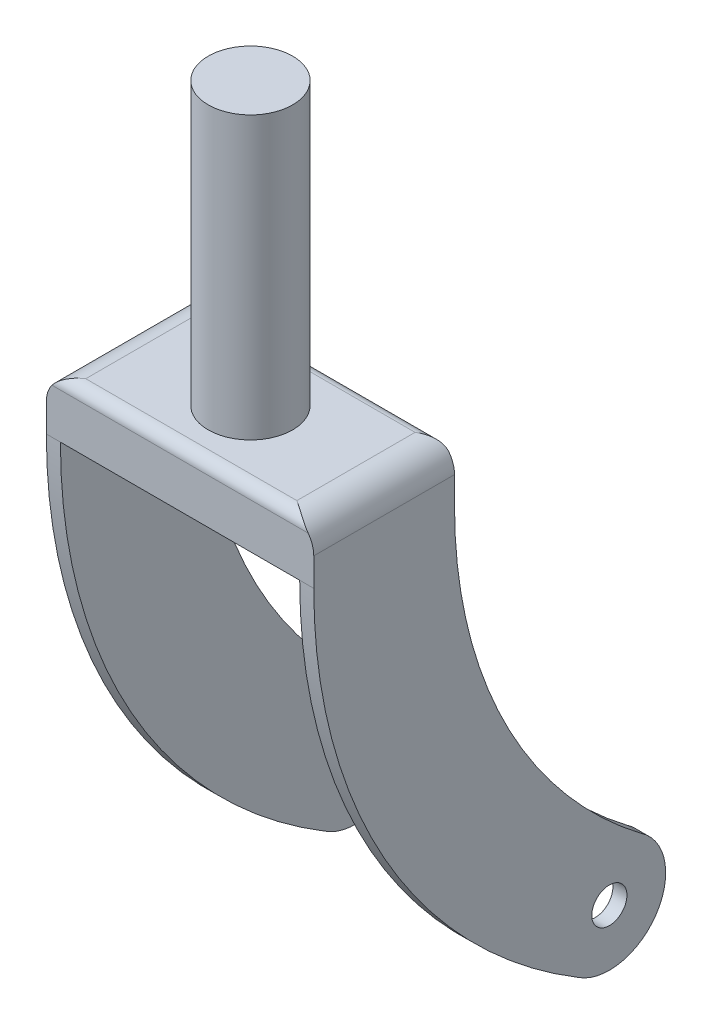
ISO-10303-21;
HEADER;
FILE_DESCRIPTION(('STEP AP214'),'2;1');
FILE_NAME('part.step','',(''),(''),'','','');
FILE_SCHEMA(('AUTOMOTIVE_DESIGN { 1 0 10303 214 1 1 1 1 }'));
ENDSEC;
DATA;
#1=APPLICATION_CONTEXT('core data for automotive mechanical design processes');
#2=APPLICATION_PROTOCOL_DEFINITION('international standard','automotive_design',2000,#1);
#3=PRODUCT_CONTEXT('',#1,'mechanical');
#4=PRODUCT('Part','Part','',(#3));
#5=PRODUCT_RELATED_PRODUCT_CATEGORY('part','',(#4));
#6=PRODUCT_DEFINITION_FORMATION('','',#4);
#7=PRODUCT_DEFINITION_CONTEXT('part definition',#1,'design');
#8=PRODUCT_DEFINITION('design','',#6,#7);
#9=PRODUCT_DEFINITION_SHAPE('','',#8);
#10=(LENGTH_UNIT() NAMED_UNIT(*) SI_UNIT(.MILLI.,.METRE.));
#11=(NAMED_UNIT(*) PLANE_ANGLE_UNIT() SI_UNIT($,.RADIAN.));
#12=(NAMED_UNIT(*) SI_UNIT($,.STERADIAN.) SOLID_ANGLE_UNIT());
#13=UNCERTAINTY_MEASURE_WITH_UNIT(LENGTH_MEASURE(1.E-05),#10,'distance_accuracy_value','');
#14=(GEOMETRIC_REPRESENTATION_CONTEXT(3) GLOBAL_UNCERTAINTY_ASSIGNED_CONTEXT((#13)) GLOBAL_UNIT_ASSIGNED_CONTEXT((#10,
#11,#12)) REPRESENTATION_CONTEXT('',''));
#15=CARTESIAN_POINT('',(0.,0.,0.));
#16=DIRECTION('',(0.,0.,1.));
#17=DIRECTION('',(1.,0.,0.));
#18=AXIS2_PLACEMENT_3D('',#15,#16,#17);
#19=CARTESIAN_POINT('',(-30.1625,107.95,66.675));
#20=DIRECTION('',(0.,1.,0.));
#21=DIRECTION('',(0.,0.,1.));
#22=AXIS2_PLACEMENT_3D('',#19,#20,#21);
#23=PLANE('',#22);
#24=DIRECTION('',(1.,0.,0.));
#25=VECTOR('',#24,1.);
#26=CARTESIAN_POINT('',(-30.1625,107.95,64.135));
#27=LINE('',#26,#25);
#28=CARTESIAN_POINT('',(-23.8125,107.95,64.135));
#29=VERTEX_POINT('',#28);
#30=CARTESIAN_POINT('',(23.8125,107.95,64.135));
#31=VERTEX_POINT('',#30);
#32=EDGE_CURVE('E195',#29,#31,#27,.T.);
#33=ORIENTED_EDGE('',*,*,#32,.T.);
#34=DIRECTION('',(0.,0.,1.));
#35=VECTOR('',#34,1.);
#36=CARTESIAN_POINT('',(23.8125,107.95,66.675));
#37=LINE('',#36,#35);
#38=CARTESIAN_POINT('',(23.8125,107.95,37.465));
#39=VERTEX_POINT('',#38);
#40=EDGE_CURVE('E198',#31,#39,#37,.F.);
#41=ORIENTED_EDGE('',*,*,#40,.T.);
#42=DIRECTION('',(1.,0.,0.));
#43=VECTOR('',#42,1.);
#44=CARTESIAN_POINT('',(-30.1625,107.95,37.465));
#45=LINE('',#44,#43);
#46=CARTESIAN_POINT('',(-23.8125,107.95,37.465));
#47=VERTEX_POINT('',#46);
#48=EDGE_CURVE('E192',#39,#47,#45,.F.);
#49=ORIENTED_EDGE('',*,*,#48,.T.);
#50=DIRECTION('',(0.,0.,1.));
#51=VECTOR('',#50,1.);
#52=CARTESIAN_POINT('',(-23.8125,107.95,66.675));
#53=LINE('',#52,#51);
#54=EDGE_CURVE('E190',#47,#29,#53,.T.);
#55=ORIENTED_EDGE('',*,*,#54,.T.);
#56=EDGE_LOOP('',(#33,#41,#49,#55));
#57=FACE_BOUND('',#56,.T.);
#58=CARTESIAN_POINT('',(0.,107.95,50.8));
#59=DIRECTION('',(0.,1.,0.));
#60=DIRECTION('',(0.,0.,1.));
#61=AXIS2_PLACEMENT_3D('',#58,#59,#60);
#62=CIRCLE('',#61,9.525);
#63=CARTESIAN_POINT('',(0.,107.95,60.325));
#64=VERTEX_POINT('',#63);
#65=EDGE_CURVE('E241',#64,#64,#62,.T.);
#66=ORIENTED_EDGE('',*,*,#65,.F.);
#67=EDGE_LOOP('',(#66));
#68=FACE_BOUND('',#67,.T.);
#69=ADVANCED_FACE('F34',(#57,#68),#23,.T.);
#70=CARTESIAN_POINT('',(-30.1625,95.25,-71.4873299764583));
#71=DIRECTION('',(1.,0.,0.));
#72=DIRECTION('',(0.,0.,-1.));
#73=AXIS2_PLACEMENT_3D('',#70,#71,#72);
#74=CYLINDRICAL_SURFACE('',#73,106.412329976458);
#75=CARTESIAN_POINT('',(-26.9875,95.25,-71.4873299764583));
#76=DIRECTION('',(-1.,0.,0.));
#77=DIRECTION('',(0.,-1.,0.));
#78=AXIS2_PLACEMENT_3D('',#75,#76,#77);
#79=CIRCLE('',#78,106.412329976458);
#80=CARTESIAN_POINT('',(-26.9875,10.5467128027682,-7.07508650519034));
#81=VERTEX_POINT('',#80);
#82=CARTESIAN_POINT('',(-26.9875,95.25,34.925));
#83=VERTEX_POINT('',#82);
#84=EDGE_CURVE('E147',#81,#83,#79,.T.);
#85=ORIENTED_EDGE('',*,*,#84,.F.);
#86=DIRECTION('',(1.,0.,0.));
#87=VECTOR('',#86,1.);
#88=CARTESIAN_POINT('',(-30.1625,10.5467128027682,-7.07508650519034));
#89=LINE('',#88,#87);
#90=CARTESIAN_POINT('',(-30.1625,10.5467128027682,-7.07508650519034));
#91=VERTEX_POINT('',#90);
#92=EDGE_CURVE('E291',#91,#81,#89,.T.);
#93=ORIENTED_EDGE('',*,*,#92,.F.);
#94=CARTESIAN_POINT('',(-30.1625,95.25,-71.4873299764583));
#95=DIRECTION('',(-1.,0.,0.));
#96=DIRECTION('',(0.,0.,-1.));
#97=AXIS2_PLACEMENT_3D('',#94,#95,#96);
#98=CIRCLE('',#97,106.412329976458);
#99=CARTESIAN_POINT('',(-30.1625,95.25,34.925));
#100=VERTEX_POINT('',#99);
#101=EDGE_CURVE('E285',#91,#100,#98,.T.);
#102=ORIENTED_EDGE('',*,*,#101,.T.);
#103=DIRECTION('',(1.,0.,0.));
#104=VECTOR('',#103,1.);
#105=CARTESIAN_POINT('',(-30.1625,95.25,34.925));
#106=LINE('',#105,#104);
#107=EDGE_CURVE('E193',#100,#83,#106,.T.);
#108=ORIENTED_EDGE('',*,*,#107,.T.);
#109=EDGE_LOOP('',(#85,#93,#102,#108));
#110=FACE_BOUND('',#109,.T.);
#111=ADVANCED_FACE('F313',(#110),#74,.F.);
#112=CARTESIAN_POINT('',(-30.1625,0.,0.));
#113=DIRECTION('',(1.,0.,0.));
#114=DIRECTION('',(0.,0.,-1.));
#115=AXIS2_PLACEMENT_3D('',#112,#113,#114);
#116=CYLINDRICAL_SURFACE('',#115,12.7);
#117=DIRECTION('',(1.,0.,0.));
#118=VECTOR('',#117,1.);
#119=CARTESIAN_POINT('',(-30.1625,-10.5467128027682,7.07508650519028));
#120=LINE('',#119,#118);
#121=CARTESIAN_POINT('',(26.9875,-10.5467128027682,7.07508650519028));
#122=VERTEX_POINT('',#121);
#123=CARTESIAN_POINT('',(30.1625,-10.5467128027682,7.07508650519028));
#124=VERTEX_POINT('',#123);
#125=EDGE_CURVE('E177',#122,#124,#120,.T.);
#126=ORIENTED_EDGE('',*,*,#125,.F.);
#127=CARTESIAN_POINT('',(26.9875,0.,0.));
#128=DIRECTION('',(1.,0.,0.));
#129=DIRECTION('',(0.,1.,0.));
#130=AXIS2_PLACEMENT_3D('',#127,#128,#129);
#131=CIRCLE('',#130,12.7);
#132=CARTESIAN_POINT('',(26.9875,10.5467128027682,-7.07508650519034));
#133=VERTEX_POINT('',#132);
#134=EDGE_CURVE('E301',#133,#122,#131,.F.);
#135=ORIENTED_EDGE('',*,*,#134,.F.);
#136=CARTESIAN_POINT('',(30.1625,10.5467128027682,-7.07508650519034));
#137=VERTEX_POINT('',#136);
#138=EDGE_CURVE('E293',#133,#137,#89,.T.);
#139=ORIENTED_EDGE('',*,*,#138,.T.);
#140=CARTESIAN_POINT('',(30.1625,0.,0.));
#141=DIRECTION('',(1.,0.,0.));
#142=DIRECTION('',(0.,0.,1.));
#143=AXIS2_PLACEMENT_3D('',#140,#141,#142);
#144=CIRCLE('',#143,12.7);
#145=EDGE_CURVE('E275',#124,#137,#144,.T.);
#146=ORIENTED_EDGE('',*,*,#145,.F.);
#147=EDGE_LOOP('',(#126,#135,#139,#146));
#148=FACE_BOUND('',#147,.T.);
#149=ADVANCED_FACE('F300',(#148),#116,.T.);
#150=CARTESIAN_POINT('',(-30.1625,95.25,-57.025633640553));
#151=DIRECTION('',(1.,0.,0.));
#152=DIRECTION('',(0.,0.,-1.));
#153=AXIS2_PLACEMENT_3D('',#150,#151,#152);
#154=CYLINDRICAL_SURFACE('',#153,123.700633640553);
#155=CARTESIAN_POINT('',(-26.9875,95.25,-57.025633640553));
#156=DIRECTION('',(-1.,0.,0.));
#157=DIRECTION('',(0.,-1.,0.));
#158=AXIS2_PLACEMENT_3D('',#155,#156,#157);
#159=CIRCLE('',#158,123.700633640553);
#160=CARTESIAN_POINT('',(-26.9875,95.25,66.6750000000001));
#161=VERTEX_POINT('',#160);
#162=CARTESIAN_POINT('',(-26.9875,-10.5467128027682,7.07508650519028));
#163=VERTEX_POINT('',#162);
#164=EDGE_CURVE('E144',#161,#163,#159,.F.);
#165=ORIENTED_EDGE('',*,*,#164,.F.);
#166=DIRECTION('',(1.,0.,0.));
#167=VECTOR('',#166,1.);
#168=CARTESIAN_POINT('',(-30.1625,95.25,66.675));
#169=LINE('',#168,#167);
#170=CARTESIAN_POINT('',(-30.1625,95.25,66.675));
#171=VERTEX_POINT('',#170);
#172=EDGE_CURVE('E167',#171,#161,#169,.T.);
#173=ORIENTED_EDGE('',*,*,#172,.F.);
#174=CARTESIAN_POINT('',(-30.1625,95.25,-57.025633640553));
#175=DIRECTION('',(1.,0.,0.));
#176=DIRECTION('',(0.,0.,-1.));
#177=AXIS2_PLACEMENT_3D('',#174,#175,#176);
#178=CIRCLE('',#177,123.700633640553);
#179=CARTESIAN_POINT('',(-30.1625,-10.5467128027682,7.07508650519028));
#180=VERTEX_POINT('',#179);
#181=EDGE_CURVE('E280',#171,#180,#178,.T.);
#182=ORIENTED_EDGE('',*,*,#181,.T.);
#183=EDGE_CURVE('E169',#180,#163,#120,.T.);
#184=ORIENTED_EDGE('',*,*,#183,.T.);
#185=EDGE_LOOP('',(#165,#173,#182,#184));
#186=FACE_BOUND('',#185,.T.);
#187=ADVANCED_FACE('F165',(#186),#154,.T.);
#188=CARTESIAN_POINT('',(-30.1625,0.,0.));
#189=DIRECTION('',(1.,0.,0.));
#190=DIRECTION('',(0.,0.,-1.));
#191=AXIS2_PLACEMENT_3D('',#188,#189,#190);
#192=CYLINDRICAL_SURFACE('',#191,3.96874999999998);
#193=CARTESIAN_POINT('',(-26.9875,0.,0.));
#194=DIRECTION('',(-1.,0.,0.));
#195=DIRECTION('',(0.,-1.,0.));
#196=AXIS2_PLACEMENT_3D('',#193,#194,#195);
#197=CIRCLE('',#196,3.96874999999998);
#198=CARTESIAN_POINT('',(-26.9875,0.,-3.96875000000001));
#199=VERTEX_POINT('',#198);
#200=EDGE_CURVE('E171',#199,#199,#197,.F.);
#201=CARTESIAN_POINT('',(-30.1625,0.,0.));
#202=DIRECTION('',(1.,0.,0.));
#203=DIRECTION('',(0.,0.,-1.));
#204=AXIS2_PLACEMENT_3D('',#201,#202,#203);
#205=CIRCLE('',#204,3.96874999999998);
#206=CARTESIAN_POINT('',(-30.1625,0.,-3.96875000000001));
#207=VERTEX_POINT('',#206);
#208=EDGE_CURVE('E271',#207,#207,#205,.T.);
#209=CARTESIAN_POINT('',(-26.9875,0.,-3.96875000000001));
#210=CARTESIAN_POINT('',(-27.0205729166666,0.,-3.96875000000001));
#211=CARTESIAN_POINT('',(-27.0536458333333,0.,-3.96875000000001));
#212=CARTESIAN_POINT('',(-27.1197916666667,0.,-3.96875000000001));
#213=CARTESIAN_POINT('',(-27.1528645833333,0.,-3.96875000000001));
#214=CARTESIAN_POINT('',(-27.2190104166667,0.,-3.96875000000001));
#215=CARTESIAN_POINT('',(-27.2520833333333,0.,-3.96875000000001));
#216=CARTESIAN_POINT('',(-27.3182291666667,0.,-3.96875000000001));
#217=CARTESIAN_POINT('',(-27.3513020833333,0.,-3.96875000000001));
#218=CARTESIAN_POINT('',(-27.4174479166667,0.,-3.96875000000001));
#219=CARTESIAN_POINT('',(-27.4505208333333,0.,-3.96875000000001));
#220=CARTESIAN_POINT('',(-27.5166666666667,0.,-3.96875000000001));
#221=CARTESIAN_POINT('',(-27.5497395833333,0.,-3.96875000000001));
#222=CARTESIAN_POINT('',(-27.6158854166667,0.,-3.96875000000001));
#223=CARTESIAN_POINT('',(-27.6489583333333,0.,-3.96875000000001));
#224=CARTESIAN_POINT('',(-27.7151041666667,0.,-3.96875000000001));
#225=CARTESIAN_POINT('',(-27.7481770833333,0.,-3.96875000000001));
#226=CARTESIAN_POINT('',(-27.8143229166667,0.,-3.96875000000001));
#227=CARTESIAN_POINT('',(-27.8473958333333,0.,-3.96875000000001));
#228=CARTESIAN_POINT('',(-27.9135416666667,0.,-3.96875000000001));
#229=CARTESIAN_POINT('',(-27.9466145833333,0.,-3.96875000000001));
#230=CARTESIAN_POINT('',(-28.0127604166667,0.,-3.96875000000001));
#231=CARTESIAN_POINT('',(-28.0458333333333,0.,-3.96875000000001));
#232=CARTESIAN_POINT('',(-28.1119791666667,0.,-3.96875000000001));
#233=CARTESIAN_POINT('',(-28.1450520833333,0.,-3.96875000000001));
#234=CARTESIAN_POINT('',(-28.2111979166667,0.,-3.96875000000001));
#235=CARTESIAN_POINT('',(-28.2442708333333,0.,-3.96875000000001));
#236=CARTESIAN_POINT('',(-28.3104166666667,0.,-3.96875000000001));
#237=CARTESIAN_POINT('',(-28.3434895833333,0.,-3.96875000000001));
#238=CARTESIAN_POINT('',(-28.4096354166667,0.,-3.96875000000001));
#239=CARTESIAN_POINT('',(-28.4427083333333,0.,-3.96875000000001));
#240=CARTESIAN_POINT('',(-28.5088541666667,0.,-3.96875000000001));
#241=CARTESIAN_POINT('',(-28.5419270833333,0.,-3.96875000000001));
#242=CARTESIAN_POINT('',(-28.6080729166667,0.,-3.96875000000001));
#243=CARTESIAN_POINT('',(-28.6411458333333,0.,-3.96875000000001));
#244=CARTESIAN_POINT('',(-28.7072916666667,0.,-3.96875000000001));
#245=CARTESIAN_POINT('',(-28.7403645833333,0.,-3.96875000000001));
#246=CARTESIAN_POINT('',(-28.8065104166667,0.,-3.96875000000001));
#247=CARTESIAN_POINT('',(-28.8395833333333,0.,-3.96875000000001));
#248=CARTESIAN_POINT('',(-28.9057291666667,0.,-3.96875000000001));
#249=CARTESIAN_POINT('',(-28.9388020833333,0.,-3.96875000000001));
#250=CARTESIAN_POINT('',(-29.0049479166667,0.,-3.96875000000001));
#251=CARTESIAN_POINT('',(-29.0380208333333,0.,-3.96875000000001));
#252=CARTESIAN_POINT('',(-29.1041666666667,0.,-3.96875000000001));
#253=CARTESIAN_POINT('',(-29.1372395833333,0.,-3.96875000000001));
#254=CARTESIAN_POINT('',(-29.2033854166667,0.,-3.96875000000001));
#255=CARTESIAN_POINT('',(-29.2364583333333,0.,-3.96875000000001));
#256=CARTESIAN_POINT('',(-29.3026041666667,0.,-3.96875000000001));
#257=CARTESIAN_POINT('',(-29.3356770833333,0.,-3.96875000000001));
#258=CARTESIAN_POINT('',(-29.4018229166667,0.,-3.96875000000001));
#259=CARTESIAN_POINT('',(-29.4348958333333,0.,-3.96875000000001));
#260=CARTESIAN_POINT('',(-29.5010416666667,0.,-3.96875000000001));
#261=CARTESIAN_POINT('',(-29.5341145833333,0.,-3.96875000000001));
#262=CARTESIAN_POINT('',(-29.6002604166667,0.,-3.96875000000001));
#263=CARTESIAN_POINT('',(-29.6333333333333,0.,-3.96875000000001));
#264=CARTESIAN_POINT('',(-29.6994791666667,0.,-3.96875000000001));
#265=CARTESIAN_POINT('',(-29.7325520833333,0.,-3.96875000000001));
#266=CARTESIAN_POINT('',(-29.7986979166667,0.,-3.96875000000001));
#267=CARTESIAN_POINT('',(-29.8317708333333,0.,-3.96875000000001));
#268=CARTESIAN_POINT('',(-29.8979166666667,0.,-3.96875000000001));
#269=CARTESIAN_POINT('',(-29.9309895833333,0.,-3.96875000000001));
#270=CARTESIAN_POINT('',(-29.9971354166667,0.,-3.96875000000001));
#271=CARTESIAN_POINT('',(-30.0302083333333,0.,-3.96875000000001));
#272=CARTESIAN_POINT('',(-30.0963541666667,0.,-3.96875000000001));
#273=CARTESIAN_POINT('',(-30.1294270833333,0.,-3.96875000000001));
#274=CARTESIAN_POINT('',(-30.1625,0.,-3.96875000000001));
#275=B_SPLINE_CURVE_WITH_KNOTS('',3,(#209,#210,#211,#212,#213,#214,#215,#216,#217,#218,#219,
#220,#221,#222,#223,#224,#225,#226,#227,#228,#229,#230,#231,#232,#233,#234,#235,#236,#237,#238,
#239,#240,#241,#242,#243,#244,#245,#246,#247,#248,#249,#250,#251,#252,#253,#254,#255,#256,#257,
#258,#259,#260,#261,#262,#263,#264,#265,#266,#267,#268,#269,#270,#271,#272,#273,#274),
.UNSPECIFIED.,.F.,.F.,(4,2,2,2,2,2,2,2,2,2,2,2,2,2,2,2,2,2,2,2,2,2,2,2,2,2,2,2,2,2,2,2,4),(0.,
0.0992187500000012,0.198437500000002,0.297656250000004,0.396875000000005,0.496093750000006,
0.595312500000004,0.694531250000005,0.793750000000006,0.892968750000007,0.992187500000009,
1.09140625000001,1.19062500000001,1.28984375000001,1.38906250000001,1.48828125000001,
1.58750000000001,1.68671875000001,1.78593750000001,1.88515625000001,1.98437500000001,
2.08359375000002,2.18281250000001,2.28203125000001,2.38125000000002,2.48046875000002,
2.57968750000002,2.67890625000002,2.77812500000002,2.87734375000002,2.97656250000002,
3.07578125000002,3.17500000000002),.UNSPECIFIED.);
#276=EDGE_CURVE('BSEAM344',#199,#207,#275,.T.);
#277=ORIENTED_EDGE('',*,*,#200,.T.);
#278=ORIENTED_EDGE('',*,*,#208,.F.);
#279=ORIENTED_EDGE('',*,*,#276,.T.);
#280=ORIENTED_EDGE('',*,*,#276,.F.);
#281=EDGE_LOOP('',(#277,#279,#278,#280));
#282=FACE_BOUND('',#281,.T.);
#283=ADVANCED_FACE('F344',(#282),#192,.F.);
#284=CARTESIAN_POINT('',(-30.1625,107.95,66.675));
#285=DIRECTION('',(0.,0.,1.));
#286=DIRECTION('',(0.,-1.,0.));
#287=AXIS2_PLACEMENT_3D('',#284,#285,#286);
#288=PLANE('',#287);
#289=DIRECTION('',(0.,-1.,0.));
#290=VECTOR('',#289,1.);
#291=CARTESIAN_POINT('',(30.1625,107.95,66.675));
#292=LINE('',#291,#290);
#293=CARTESIAN_POINT('',(30.1625,101.6,66.675));
#294=VERTEX_POINT('',#293);
#295=CARTESIAN_POINT('',(30.1625,95.25,66.675));
#296=VERTEX_POINT('',#295);
#297=EDGE_CURVE('E252',#294,#296,#292,.T.);
#298=ORIENTED_EDGE('',*,*,#297,.F.);
#299=CARTESIAN_POINT('',(23.8125,101.6,66.675));
#300=DIRECTION('',(0.,0.,1.));
#301=DIRECTION('',(0.,-1.,0.));
#302=AXIS2_PLACEMENT_3D('',#299,#300,#301);
#303=CIRCLE('',#302,6.35);
#304=CARTESIAN_POINT('',(28.8925,105.41,66.675));
#305=VERTEX_POINT('',#304);
#306=EDGE_CURVE('E205',#294,#305,#303,.T.);
#307=ORIENTED_EDGE('',*,*,#306,.T.);
#308=DIRECTION('',(1.,0.,0.));
#309=VECTOR('',#308,1.);
#310=CARTESIAN_POINT('',(-30.1625,105.41,66.675));
#311=LINE('',#310,#309);
#312=CARTESIAN_POINT('',(-28.8925,105.41,66.675));
#313=VERTEX_POINT('',#312);
#314=EDGE_CURVE('E202',#305,#313,#311,.F.);
#315=ORIENTED_EDGE('',*,*,#314,.T.);
#316=CARTESIAN_POINT('',(-23.8125,101.6,66.675));
#317=DIRECTION('',(0.,0.,1.));
#318=DIRECTION('',(0.,-1.,0.));
#319=AXIS2_PLACEMENT_3D('',#316,#317,#318);
#320=CIRCLE('',#319,6.35);
#321=CARTESIAN_POINT('',(-30.1625,101.6,66.675));
#322=VERTEX_POINT('',#321);
#323=EDGE_CURVE('E200',#313,#322,#320,.T.);
#324=ORIENTED_EDGE('',*,*,#323,.T.);
#325=DIRECTION('',(0.,-1.,0.));
#326=VECTOR('',#325,1.);
#327=CARTESIAN_POINT('',(-30.1625,107.95,66.675));
#328=LINE('',#327,#326);
#329=EDGE_CURVE('E176',#322,#171,#328,.T.);
#330=ORIENTED_EDGE('',*,*,#329,.T.);
#331=ORIENTED_EDGE('',*,*,#172,.T.);
#332=DIRECTION('',(-1.,0.,0.));
#333=VECTOR('',#332,1.);
#334=CARTESIAN_POINT('',(-26.9875,95.25,66.6750000000001));
#335=LINE('',#334,#333);
#336=CARTESIAN_POINT('',(26.9875,95.25,66.675));
#337=VERTEX_POINT('',#336);
#338=EDGE_CURVE('E154',#337,#161,#335,.T.);
#339=ORIENTED_EDGE('',*,*,#338,.F.);
#340=EDGE_CURVE('E178',#337,#296,#169,.T.);
#341=ORIENTED_EDGE('',*,*,#340,.T.);
#342=EDGE_LOOP('',(#298,#307,#315,#324,#330,#331,#339,#341));
#343=FACE_BOUND('',#342,.T.);
#344=ADVANCED_FACE('F174',(#343),#288,.T.);
#345=CARTESIAN_POINT('',(-30.1625,107.95,34.925));
#346=DIRECTION('',(0.,0.,-1.));
#347=DIRECTION('',(0.,1.,0.));
#348=AXIS2_PLACEMENT_3D('',#345,#346,#347);
#349=PLANE('',#348);
#350=DIRECTION('',(1.,0.,0.));
#351=VECTOR('',#350,1.);
#352=CARTESIAN_POINT('',(-30.1625,105.41,34.925));
#353=LINE('',#352,#351);
#354=CARTESIAN_POINT('',(-28.8925,105.41,34.925));
#355=VERTEX_POINT('',#354);
#356=CARTESIAN_POINT('',(28.8925,105.41,34.925));
#357=VERTEX_POINT('',#356);
#358=EDGE_CURVE('E55',#355,#357,#353,.T.);
#359=ORIENTED_EDGE('',*,*,#358,.T.);
#360=CARTESIAN_POINT('',(23.8125,101.6,34.925));
#361=DIRECTION('',(0.,0.,-1.));
#362=DIRECTION('',(0.,1.,0.));
#363=AXIS2_PLACEMENT_3D('',#360,#361,#362);
#364=CIRCLE('',#363,6.35);
#365=CARTESIAN_POINT('',(30.1625,101.6,34.925));
#366=VERTEX_POINT('',#365);
#367=EDGE_CURVE('E209',#357,#366,#364,.T.);
#368=ORIENTED_EDGE('',*,*,#367,.T.);
#369=DIRECTION('',(0.,1.,0.));
#370=VECTOR('',#369,1.);
#371=CARTESIAN_POINT('',(30.1625,107.95,34.925));
#372=LINE('',#371,#370);
#373=CARTESIAN_POINT('',(30.1625,95.25,34.925));
#374=VERTEX_POINT('',#373);
#375=EDGE_CURVE('E263',#374,#366,#372,.T.);
#376=ORIENTED_EDGE('',*,*,#375,.F.);
#377=CARTESIAN_POINT('',(26.9875,95.25,34.925));
#378=VERTEX_POINT('',#377);
#379=EDGE_CURVE('E290',#378,#374,#106,.T.);
#380=ORIENTED_EDGE('',*,*,#379,.F.);
#381=DIRECTION('',(1.,0.,0.));
#382=VECTOR('',#381,1.);
#383=CARTESIAN_POINT('',(-30.1625,95.25,34.925));
#384=LINE('',#383,#382);
#385=EDGE_CURVE('E308',#83,#378,#384,.T.);
#386=ORIENTED_EDGE('',*,*,#385,.F.);
#387=ORIENTED_EDGE('',*,*,#107,.F.);
#388=DIRECTION('',(0.,1.,0.));
#389=VECTOR('',#388,1.);
#390=CARTESIAN_POINT('',(-30.1625,107.95,34.925));
#391=LINE('',#390,#389);
#392=CARTESIAN_POINT('',(-30.1625,101.6,34.925));
#393=VERTEX_POINT('',#392);
#394=EDGE_CURVE('E181',#100,#393,#391,.T.);
#395=ORIENTED_EDGE('',*,*,#394,.T.);
#396=CARTESIAN_POINT('',(-23.8125,101.6,34.925));
#397=DIRECTION('',(0.,0.,-1.));
#398=DIRECTION('',(0.,1.,0.));
#399=AXIS2_PLACEMENT_3D('',#396,#397,#398);
#400=CIRCLE('',#399,6.35);
#401=EDGE_CURVE('E60',#393,#355,#400,.T.);
#402=ORIENTED_EDGE('',*,*,#401,.T.);
#403=EDGE_LOOP('',(#359,#368,#376,#380,#386,#387,#395,#402));
#404=FACE_BOUND('',#403,.T.);
#405=ADVANCED_FACE('F261',(#404),#349,.T.);
#406=CARTESIAN_POINT('',(26.9875,95.25,-71.4873299764583));
#407=DIRECTION('',(1.,0.,0.));
#408=DIRECTION('',(0.,1.,0.));
#409=AXIS2_PLACEMENT_3D('',#406,#407,#408);
#410=CIRCLE('',#409,106.412329976458);
#411=EDGE_CURVE('E189',#378,#133,#410,.T.);
#412=ORIENTED_EDGE('',*,*,#411,.F.);
#413=ORIENTED_EDGE('',*,*,#379,.T.);
#414=CARTESIAN_POINT('',(30.1625,95.25,-71.4873299764583));
#415=DIRECTION('',(-1.,0.,0.));
#416=DIRECTION('',(0.,0.,-1.));
#417=AXIS2_PLACEMENT_3D('',#414,#415,#416);
#418=CIRCLE('',#417,106.412329976458);
#419=EDGE_CURVE('E270',#137,#374,#418,.T.);
#420=ORIENTED_EDGE('',*,*,#419,.F.);
#421=ORIENTED_EDGE('',*,*,#138,.F.);
#422=EDGE_LOOP('',(#412,#413,#420,#421));
#423=FACE_BOUND('',#422,.T.);
#424=ADVANCED_FACE('F307',(#423),#74,.F.);
#425=CARTESIAN_POINT('',(-26.9875,0.,0.));
#426=DIRECTION('',(-1.,0.,0.));
#427=DIRECTION('',(0.,-1.,0.));
#428=AXIS2_PLACEMENT_3D('',#425,#426,#427);
#429=CIRCLE('',#428,12.7);
#430=EDGE_CURVE('E170',#163,#81,#429,.F.);
#431=ORIENTED_EDGE('',*,*,#430,.F.);
#432=ORIENTED_EDGE('',*,*,#183,.F.);
#433=CARTESIAN_POINT('',(-30.1625,0.,0.));
#434=DIRECTION('',(1.,0.,0.));
#435=DIRECTION('',(0.,0.,1.));
#436=AXIS2_PLACEMENT_3D('',#433,#434,#435);
#437=CIRCLE('',#436,12.7);
#438=EDGE_CURVE('E282',#180,#91,#437,.T.);
#439=ORIENTED_EDGE('',*,*,#438,.T.);
#440=ORIENTED_EDGE('',*,*,#92,.T.);
#441=EDGE_LOOP('',(#431,#432,#439,#440));
#442=FACE_BOUND('',#441,.T.);
#443=ADVANCED_FACE('F318',(#442),#116,.T.);
#444=CARTESIAN_POINT('',(26.9875,95.25,-57.025633640553));
#445=DIRECTION('',(1.,0.,0.));
#446=DIRECTION('',(0.,1.,0.));
#447=AXIS2_PLACEMENT_3D('',#444,#445,#446);
#448=CIRCLE('',#447,123.700633640553);
#449=EDGE_CURVE('E186',#122,#337,#448,.F.);
#450=ORIENTED_EDGE('',*,*,#449,.F.);
#451=ORIENTED_EDGE('',*,*,#125,.T.);
#452=CARTESIAN_POINT('',(30.1625,95.25,-57.025633640553));
#453=DIRECTION('',(1.,0.,0.));
#454=DIRECTION('',(0.,0.,-1.));
#455=AXIS2_PLACEMENT_3D('',#452,#453,#454);
#456=CIRCLE('',#455,123.700633640553);
#457=EDGE_CURVE('E306',#296,#124,#456,.T.);
#458=ORIENTED_EDGE('',*,*,#457,.F.);
#459=ORIENTED_EDGE('',*,*,#340,.F.);
#460=EDGE_LOOP('',(#450,#451,#458,#459));
#461=FACE_BOUND('',#460,.T.);
#462=ADVANCED_FACE('F329',(#461),#154,.T.);
#463=CARTESIAN_POINT('',(-30.1625,95.25,-57.025633640553));
#464=DIRECTION('',(1.,0.,0.));
#465=DIRECTION('',(0.,0.,-1.));
#466=AXIS2_PLACEMENT_3D('',#463,#464,#465);
#467=PLANE('',#466);
#468=ORIENTED_EDGE('',*,*,#208,.T.);
#469=EDGE_LOOP('',(#468));
#470=FACE_BOUND('',#469,.T.);
#471=ORIENTED_EDGE('',*,*,#329,.F.);
#472=DIRECTION('',(0.,0.,1.));
#473=VECTOR('',#472,1.);
#474=CARTESIAN_POINT('',(-30.1625,101.6,34.925));
#475=LINE('',#474,#473);
#476=EDGE_CURVE('E12',#322,#393,#475,.F.);
#477=ORIENTED_EDGE('',*,*,#476,.T.);
#478=ORIENTED_EDGE('',*,*,#394,.F.);
#479=ORIENTED_EDGE('',*,*,#101,.F.);
#480=ORIENTED_EDGE('',*,*,#438,.F.);
#481=ORIENTED_EDGE('',*,*,#181,.F.);
#482=EDGE_LOOP('',(#471,#477,#478,#479,#480,#481));
#483=FACE_BOUND('',#482,.T.);
#484=ADVANCED_FACE('F317',(#470,#483),#467,.F.);
#485=CARTESIAN_POINT('',(26.9875,0.,0.));
#486=DIRECTION('',(1.,0.,0.));
#487=DIRECTION('',(0.,1.,0.));
#488=AXIS2_PLACEMENT_3D('',#485,#486,#487);
#489=CIRCLE('',#488,3.96874999999998);
#490=CARTESIAN_POINT('',(26.9875,0.,-3.96875000000001));
#491=VERTEX_POINT('',#490);
#492=EDGE_CURVE('E150',#491,#491,#489,.F.);
#493=CARTESIAN_POINT('',(30.1625,0.,0.));
#494=DIRECTION('',(1.,0.,0.));
#495=DIRECTION('',(0.,0.,-1.));
#496=AXIS2_PLACEMENT_3D('',#493,#494,#495);
#497=CIRCLE('',#496,3.96874999999998);
#498=CARTESIAN_POINT('',(30.1625,0.,-3.96875000000001));
#499=VERTEX_POINT('',#498);
#500=EDGE_CURVE('E310',#499,#499,#497,.T.);
#501=CARTESIAN_POINT('',(26.9875,0.,-3.96875000000001));
#502=CARTESIAN_POINT('',(27.0205729166667,0.,-3.96875000000001));
#503=CARTESIAN_POINT('',(27.0536458333333,0.,-3.96875000000001));
#504=CARTESIAN_POINT('',(27.1197916666667,0.,-3.96875000000001));
#505=CARTESIAN_POINT('',(27.1528645833333,0.,-3.96875000000001));
#506=CARTESIAN_POINT('',(27.2190104166667,0.,-3.96875000000001));
#507=CARTESIAN_POINT('',(27.2520833333333,0.,-3.96875000000001));
#508=CARTESIAN_POINT('',(27.3182291666667,0.,-3.96875000000001));
#509=CARTESIAN_POINT('',(27.3513020833333,0.,-3.96875000000001));
#510=CARTESIAN_POINT('',(27.4174479166667,0.,-3.96875000000001));
#511=CARTESIAN_POINT('',(27.4505208333333,0.,-3.96875000000001));
#512=CARTESIAN_POINT('',(27.5166666666667,0.,-3.96875000000001));
#513=CARTESIAN_POINT('',(27.5497395833333,0.,-3.96875000000001));
#514=CARTESIAN_POINT('',(27.6158854166667,0.,-3.96875000000001));
#515=CARTESIAN_POINT('',(27.6489583333333,0.,-3.96875000000001));
#516=CARTESIAN_POINT('',(27.7151041666667,0.,-3.96875000000001));
#517=CARTESIAN_POINT('',(27.7481770833333,0.,-3.96875000000001));
#518=CARTESIAN_POINT('',(27.8143229166667,0.,-3.96875000000001));
#519=CARTESIAN_POINT('',(27.8473958333333,0.,-3.96875000000001));
#520=CARTESIAN_POINT('',(27.9135416666667,0.,-3.96875000000001));
#521=CARTESIAN_POINT('',(27.9466145833333,0.,-3.96875000000001));
#522=CARTESIAN_POINT('',(28.0127604166667,0.,-3.96875000000001));
#523=CARTESIAN_POINT('',(28.0458333333333,0.,-3.96875000000001));
#524=CARTESIAN_POINT('',(28.1119791666667,0.,-3.96875000000001));
#525=CARTESIAN_POINT('',(28.1450520833333,0.,-3.96875000000001));
#526=CARTESIAN_POINT('',(28.2111979166667,0.,-3.96875000000001));
#527=CARTESIAN_POINT('',(28.2442708333333,0.,-3.96875000000001));
#528=CARTESIAN_POINT('',(28.3104166666667,0.,-3.96875000000001));
#529=CARTESIAN_POINT('',(28.3434895833333,0.,-3.96875000000001));
#530=CARTESIAN_POINT('',(28.4096354166667,0.,-3.96875000000001));
#531=CARTESIAN_POINT('',(28.4427083333333,0.,-3.96875000000001));
#532=CARTESIAN_POINT('',(28.5088541666667,0.,-3.96875000000001));
#533=CARTESIAN_POINT('',(28.5419270833333,0.,-3.96875000000001));
#534=CARTESIAN_POINT('',(28.6080729166667,0.,-3.96875000000001));
#535=CARTESIAN_POINT('',(28.6411458333333,0.,-3.96875000000001));
#536=CARTESIAN_POINT('',(28.7072916666667,0.,-3.96875000000001));
#537=CARTESIAN_POINT('',(28.7403645833333,0.,-3.96875000000001));
#538=CARTESIAN_POINT('',(28.8065104166667,0.,-3.96875000000001));
#539=CARTESIAN_POINT('',(28.8395833333333,0.,-3.96875000000001));
#540=CARTESIAN_POINT('',(28.9057291666667,0.,-3.96875000000001));
#541=CARTESIAN_POINT('',(28.9388020833333,0.,-3.96875000000001));
#542=CARTESIAN_POINT('',(29.0049479166667,0.,-3.96875000000001));
#543=CARTESIAN_POINT('',(29.0380208333333,0.,-3.96875000000001));
#544=CARTESIAN_POINT('',(29.1041666666667,0.,-3.96875000000001));
#545=CARTESIAN_POINT('',(29.1372395833333,0.,-3.96875000000001));
#546=CARTESIAN_POINT('',(29.2033854166667,0.,-3.96875000000001));
#547=CARTESIAN_POINT('',(29.2364583333333,0.,-3.96875000000001));
#548=CARTESIAN_POINT('',(29.3026041666667,0.,-3.96875000000001));
#549=CARTESIAN_POINT('',(29.3356770833333,0.,-3.96875000000001));
#550=CARTESIAN_POINT('',(29.4018229166667,0.,-3.96875000000001));
#551=CARTESIAN_POINT('',(29.4348958333333,0.,-3.96875000000001));
#552=CARTESIAN_POINT('',(29.5010416666667,0.,-3.96875000000001));
#553=CARTESIAN_POINT('',(29.5341145833333,0.,-3.96875000000001));
#554=CARTESIAN_POINT('',(29.6002604166667,0.,-3.96875000000001));
#555=CARTESIAN_POINT('',(29.6333333333333,0.,-3.96875000000001));
#556=CARTESIAN_POINT('',(29.6994791666667,0.,-3.96875000000001));
#557=CARTESIAN_POINT('',(29.7325520833333,0.,-3.96875000000001));
#558=CARTESIAN_POINT('',(29.7986979166667,0.,-3.96875000000001));
#559=CARTESIAN_POINT('',(29.8317708333333,0.,-3.96875000000001));
#560=CARTESIAN_POINT('',(29.8979166666667,0.,-3.96875000000001));
#561=CARTESIAN_POINT('',(29.9309895833333,0.,-3.96875000000001));
#562=CARTESIAN_POINT('',(29.9971354166667,0.,-3.96875000000001));
#563=CARTESIAN_POINT('',(30.0302083333333,0.,-3.96875000000001));
#564=CARTESIAN_POINT('',(30.0963541666667,0.,-3.96875000000001));
#565=CARTESIAN_POINT('',(30.1294270833333,0.,-3.96875000000001));
#566=CARTESIAN_POINT('',(30.1625,0.,-3.96875000000001));
#567=B_SPLINE_CURVE_WITH_KNOTS('',3,(#501,#502,#503,#504,#505,#506,#507,#508,#509,#510,#511,
#512,#513,#514,#515,#516,#517,#518,#519,#520,#521,#522,#523,#524,#525,#526,#527,#528,#529,#530,
#531,#532,#533,#534,#535,#536,#537,#538,#539,#540,#541,#542,#543,#544,#545,#546,#547,#548,#549,
#550,#551,#552,#553,#554,#555,#556,#557,#558,#559,#560,#561,#562,#563,#564,#565,#566),
.UNSPECIFIED.,.F.,.F.,(4,2,2,2,2,2,2,2,2,2,2,2,2,2,2,2,2,2,2,2,2,2,2,2,2,2,2,2,2,2,2,2,4),(0.,
0.0992187499999977,0.198437500000002,0.29765625,0.396874999999998,0.496093750000003,0.5953125,
0.694531249999998,0.793749999999996,0.892968750000001,0.992187499999998,1.09140625,1.190625,
1.28984375,1.3890625,1.48828125,1.5875,1.68671875,1.7859375,1.88515625,1.984375,2.08359375,
2.1828125,2.28203125,2.38125,2.48046875,2.5796875,2.67890624999999,2.778125,2.87734375,
2.97656249999999,3.07578125,3.175),.UNSPECIFIED.);
#568=EDGE_CURVE('BSEAM340',#491,#499,#567,.T.);
#569=ORIENTED_EDGE('',*,*,#492,.T.);
#570=ORIENTED_EDGE('',*,*,#500,.T.);
#571=ORIENTED_EDGE('',*,*,#568,.T.);
#572=ORIENTED_EDGE('',*,*,#568,.F.);
#573=EDGE_LOOP('',(#569,#571,#570,#572));
#574=FACE_BOUND('',#573,.T.);
#575=ADVANCED_FACE('F340',(#574),#192,.F.);
#576=CARTESIAN_POINT('',(30.1625,95.25,-57.025633640553));
#577=DIRECTION('',(1.,0.,0.));
#578=DIRECTION('',(0.,0.,-1.));
#579=AXIS2_PLACEMENT_3D('',#576,#577,#578);
#580=PLANE('',#579);
#581=ORIENTED_EDGE('',*,*,#375,.T.);
#582=DIRECTION('',(0.,0.,1.));
#583=VECTOR('',#582,1.);
#584=CARTESIAN_POINT('',(30.1625,101.6,-57.025633640553));
#585=LINE('',#584,#583);
#586=EDGE_CURVE('E47',#366,#294,#585,.T.);
#587=ORIENTED_EDGE('',*,*,#586,.T.);
#588=ORIENTED_EDGE('',*,*,#297,.T.);
#589=ORIENTED_EDGE('',*,*,#457,.T.);
#590=ORIENTED_EDGE('',*,*,#145,.T.);
#591=ORIENTED_EDGE('',*,*,#419,.T.);
#592=EDGE_LOOP('',(#581,#587,#588,#589,#590,#591));
#593=FACE_BOUND('',#592,.T.);
#594=ORIENTED_EDGE('',*,*,#500,.F.);
#595=EDGE_LOOP('',(#594));
#596=FACE_BOUND('',#595,.T.);
#597=ADVANCED_FACE('F266',(#593,#596),#580,.T.);
#598=CARTESIAN_POINT('',(-26.9875,95.25,-12.7));
#599=DIRECTION('',(-1.,0.,0.));
#600=DIRECTION('',(0.,-1.,0.));
#601=AXIS2_PLACEMENT_3D('',#598,#599,#600);
#602=PLANE('',#601);
#603=ORIENTED_EDGE('',*,*,#84,.T.);
#604=DIRECTION('',(0.,0.,1.));
#605=VECTOR('',#604,1.);
#606=CARTESIAN_POINT('',(-26.9875,95.25,-12.7));
#607=LINE('',#606,#605);
#608=EDGE_CURVE('E139',#83,#161,#607,.T.);
#609=ORIENTED_EDGE('',*,*,#608,.T.);
#610=ORIENTED_EDGE('',*,*,#164,.T.);
#611=ORIENTED_EDGE('',*,*,#430,.T.);
#612=EDGE_LOOP('',(#603,#609,#610,#611));
#613=FACE_BOUND('',#612,.T.);
#614=ORIENTED_EDGE('',*,*,#200,.F.);
#615=EDGE_LOOP('',(#614));
#616=FACE_BOUND('',#615,.T.);
#617=ADVANCED_FACE('F141',(#613,#616),#602,.F.);
#618=CARTESIAN_POINT('',(26.9875,95.25,-12.7));
#619=DIRECTION('',(1.,0.,0.));
#620=DIRECTION('',(0.,1.,0.));
#621=AXIS2_PLACEMENT_3D('',#618,#619,#620);
#622=PLANE('',#621);
#623=ORIENTED_EDGE('',*,*,#411,.T.);
#624=ORIENTED_EDGE('',*,*,#134,.T.);
#625=ORIENTED_EDGE('',*,*,#449,.T.);
#626=DIRECTION('',(0.,0.,1.));
#627=VECTOR('',#626,1.);
#628=CARTESIAN_POINT('',(26.9875,95.25,-12.7));
#629=LINE('',#628,#627);
#630=EDGE_CURVE('E151',#378,#337,#629,.T.);
#631=ORIENTED_EDGE('',*,*,#630,.F.);
#632=EDGE_LOOP('',(#623,#624,#625,#631));
#633=FACE_BOUND('',#632,.T.);
#634=ORIENTED_EDGE('',*,*,#492,.F.);
#635=EDGE_LOOP('',(#634));
#636=FACE_BOUND('',#635,.T.);
#637=ADVANCED_FACE('F334',(#633,#636),#622,.F.);
#638=CARTESIAN_POINT('',(-26.9875,95.25,-12.7));
#639=DIRECTION('',(0.,1.,0.));
#640=DIRECTION('',(0.,0.,1.));
#641=AXIS2_PLACEMENT_3D('',#638,#639,#640);
#642=PLANE('',#641);
#643=ORIENTED_EDGE('',*,*,#385,.T.);
#644=ORIENTED_EDGE('',*,*,#630,.T.);
#645=ORIENTED_EDGE('',*,*,#338,.T.);
#646=ORIENTED_EDGE('',*,*,#608,.F.);
#647=EDGE_LOOP('',(#643,#644,#645,#646));
#648=FACE_BOUND('',#647,.T.);
#649=ADVANCED_FACE('F155',(#648),#642,.F.);
#650=CARTESIAN_POINT('',(0.,171.45,50.8));
#651=DIRECTION('',(0.,-1.,0.));
#652=DIRECTION('',(0.,0.,-1.));
#653=AXIS2_PLACEMENT_3D('',#650,#651,#652);
#654=CYLINDRICAL_SURFACE('',#653,9.525);
#655=CARTESIAN_POINT('',(0.,171.45,50.8));
#656=DIRECTION('',(0.,1.,0.));
#657=DIRECTION('',(0.,0.,1.));
#658=AXIS2_PLACEMENT_3D('',#655,#656,#657);
#659=CIRCLE('',#658,9.525);
#660=CARTESIAN_POINT('',(0.,171.45,60.325));
#661=VERTEX_POINT('',#660);
#662=EDGE_CURVE('E161',#661,#661,#659,.T.);
#663=ORIENTED_EDGE('',*,*,#662,.F.);
#664=EDGE_LOOP('',(#663));
#665=FACE_BOUND('',#664,.T.);
#666=ORIENTED_EDGE('',*,*,#65,.T.);
#667=EDGE_LOOP('',(#666));
#668=FACE_BOUND('',#667,.T.);
#669=ADVANCED_FACE('F414',(#665,#668),#654,.T.);
#670=CARTESIAN_POINT('',(0.,171.45,50.8));
#671=DIRECTION('',(0.,1.,0.));
#672=DIRECTION('',(0.,0.,1.));
#673=AXIS2_PLACEMENT_3D('',#670,#671,#672);
#674=PLANE('',#673);
#675=ORIENTED_EDGE('',*,*,#662,.T.);
#676=EDGE_LOOP('',(#675));
#677=FACE_BOUND('',#676,.T.);
#678=ADVANCED_FACE('F424',(#677),#674,.T.);
#679=CARTESIAN_POINT('',(-30.1625,105.41,37.465));
#680=DIRECTION('',(1.,0.,0.));
#681=DIRECTION('',(0.,0.,-1.));
#682=AXIS2_PLACEMENT_3D('',#679,#680,#681);
#683=CYLINDRICAL_SURFACE('',#682,2.54);
#684=CARTESIAN_POINT('',(28.8925,105.41,34.925));
#685=CARTESIAN_POINT('',(28.8273592655406,105.496885940245,34.9250085848957));
#686=CARTESIAN_POINT('',(28.7600108760546,105.582010989097,34.9294556997048));
#687=CARTESIAN_POINT('',(28.6215743960713,105.748120872719,34.9462228337605));
#688=CARTESIAN_POINT('',(28.550492968224,105.829112606964,34.9585292366491));
#689=CARTESIAN_POINT('',(28.4057283743223,105.985892260716,34.9898680207967));
#690=CARTESIAN_POINT('',(28.3320763611712,106.061722326698,35.0088353571185));
#691=CARTESIAN_POINT('',(28.1819689553587,106.208827456226,35.0526632993833));
#692=CARTESIAN_POINT('',(28.1055119420983,106.280099819184,35.0775273589904));
#693=CARTESIAN_POINT('',(27.9172779961732,106.44717987545,35.1440040265202));
#694=CARTESIAN_POINT('',(27.8042756083239,106.540571340553,35.1882473147684));
#695=CARTESIAN_POINT('',(27.574475289018,106.717726081789,35.2851726422043));
#696=CARTESIAN_POINT('',(27.4576764100968,106.80148693044,35.3378568010135));
#697=CARTESIAN_POINT('',(27.1013862140951,107.039443978057,35.5068013440863));
#698=CARTESIAN_POINT('',(26.8571356360111,107.179323608767,35.6335254730499));
#699=CARTESIAN_POINT('',(26.4337763294238,107.38702588838,35.8651320311618));
#700=CARTESIAN_POINT('',(26.2564930633627,107.46395984831,35.9655730301802));
#701=CARTESIAN_POINT('',(25.8990095989876,107.600463677538,36.1731425111812));
#702=CARTESIAN_POINT('',(25.7188080092043,107.660024989834,36.2802742572962));
#703=CARTESIAN_POINT('',(25.3568664814022,107.762202533363,36.4989347570627));
#704=CARTESIAN_POINT('',(25.175130340342,107.804852412489,36.6104542893342));
#705=CARTESIAN_POINT('',(24.8105100894344,107.873824471784,36.836420988009));
#706=CARTESIAN_POINT('',(24.6276266394102,107.900155297908,36.9508665706448));
#707=CARTESIAN_POINT('',(24.3414740484953,107.928775332128,37.1308279069926));
#708=CARTESIAN_POINT('',(24.2383959981456,107.936543077904,37.1958338334382));
#709=CARTESIAN_POINT('',(24.0321980915123,107.947037184719,37.3260547517153));
#710=CARTESIAN_POINT('',(23.9290783128993,107.949767013758,37.3912695687496));
#711=CARTESIAN_POINT('',(23.8214796743307,107.949995237576,37.459320755463));
#712=CARTESIAN_POINT('',(23.8169898239453,107.949999999371,37.4621603861982));
#713=CARTESIAN_POINT('',(23.8125,107.95,37.465));
#714=B_SPLINE_CURVE_WITH_KNOTS('',3,(#684,#685,#686,#687,#688,#689,#690,#691,#692,#693,#694,
#695,#696,#697,#698,#699,#700,#701,#702,#703,#704,#705,#706,#707,#708,#709,#710,#711,#712,#713),
.UNSPECIFIED.,.F.,.F.,(4,2,2,2,2,2,2,2,2,2,2,2,2,2,4),(0.,0.325530814256314,0.650499164909289,
0.972378565758758,1.29444695643665,1.75312747535435,2.21192335646077,3.13415802975316,
3.7868492946582,4.43986150574287,5.09156784967923,5.74292861900373,6.1091788545767,
6.47517687685664,6.49111426070985),.UNSPECIFIED.);
#715=EDGE_CURVE('E233',#357,#39,#714,.T.);
#716=ORIENTED_EDGE('',*,*,#715,.F.);
#717=ORIENTED_EDGE('',*,*,#358,.F.);
#718=CARTESIAN_POINT('',(-28.8925,105.41,34.925));
#719=CARTESIAN_POINT('',(-28.8273592655406,105.496885940245,34.9250085848957));
#720=CARTESIAN_POINT('',(-28.7600108760546,105.582010989097,34.9294556997048));
#721=CARTESIAN_POINT('',(-28.6215743960713,105.748120872719,34.9462228337605));
#722=CARTESIAN_POINT('',(-28.550492968224,105.829112606964,34.9585292366491));
#723=CARTESIAN_POINT('',(-28.4057283743223,105.985892260716,34.9898680207967));
#724=CARTESIAN_POINT('',(-28.3320763611712,106.061722326698,35.0088353571185));
#725=CARTESIAN_POINT('',(-28.1819689553587,106.208827456226,35.0526632993833));
#726=CARTESIAN_POINT('',(-28.1055119420983,106.280099819184,35.0775273589904));
#727=CARTESIAN_POINT('',(-27.9172779961732,106.44717987545,35.1440040265202));
#728=CARTESIAN_POINT('',(-27.8042756083239,106.540571340553,35.1882473147684));
#729=CARTESIAN_POINT('',(-27.574475289018,106.717726081789,35.2851726422043));
#730=CARTESIAN_POINT('',(-27.4576764100968,106.80148693044,35.3378568010135));
#731=CARTESIAN_POINT('',(-27.1013862140951,107.039443978057,35.5068013440863));
#732=CARTESIAN_POINT('',(-26.8571356360111,107.179323608767,35.6335254730499));
#733=CARTESIAN_POINT('',(-26.4337763294238,107.38702588838,35.8651320311618));
#734=CARTESIAN_POINT('',(-26.2564930633627,107.46395984831,35.9655730301802));
#735=CARTESIAN_POINT('',(-25.8990095989876,107.600463677538,36.1731425111812));
#736=CARTESIAN_POINT('',(-25.7188080092043,107.660024989834,36.2802742572962));
#737=CARTESIAN_POINT('',(-25.3568664814022,107.762202533363,36.4989347570627));
#738=CARTESIAN_POINT('',(-25.175130340342,107.804852412489,36.6104542893342));
#739=CARTESIAN_POINT('',(-24.8105100894344,107.873824471784,36.836420988009));
#740=CARTESIAN_POINT('',(-24.6276266394102,107.900155297908,36.9508665706448));
#741=CARTESIAN_POINT('',(-24.3414740484953,107.928775332128,37.1308279069926));
#742=CARTESIAN_POINT('',(-24.2383959981456,107.936543077904,37.1958338334382));
#743=CARTESIAN_POINT('',(-24.0321980915123,107.947037184719,37.3260547517153));
#744=CARTESIAN_POINT('',(-23.9290783128993,107.949767013758,37.3912695687496));
#745=CARTESIAN_POINT('',(-23.8214796743307,107.949995237576,37.459320755463));
#746=CARTESIAN_POINT('',(-23.8169898239453,107.949999999371,37.4621603861982));
#747=CARTESIAN_POINT('',(-23.8125,107.95,37.465));
#748=B_SPLINE_CURVE_WITH_KNOTS('',3,(#718,#719,#720,#721,#722,#723,#724,#725,#726,#727,#728,
#729,#730,#731,#732,#733,#734,#735,#736,#737,#738,#739,#740,#741,#742,#743,#744,#745,#746,#747),
.UNSPECIFIED.,.F.,.F.,(4,2,2,2,2,2,2,2,2,2,2,2,2,2,4),(0.,0.325530814256314,0.650499164909289,
0.972378565758758,1.29444695643665,1.75312747535435,2.21192335646077,3.13415802975316,
3.7868492946582,4.43986150574287,5.09156784967923,5.74292861900373,6.1091788545767,
6.47517687685664,6.49111426070985),.UNSPECIFIED.);
#749=EDGE_CURVE('E39',#47,#355,#748,.F.);
#750=ORIENTED_EDGE('',*,*,#749,.F.);
#751=ORIENTED_EDGE('',*,*,#48,.F.);
#752=EDGE_LOOP('',(#716,#717,#750,#751));
#753=FACE_BOUND('',#752,.T.);
#754=ADVANCED_FACE('F36',(#753),#683,.T.);
#755=CARTESIAN_POINT('',(-23.8125,101.6,66.675));
#756=DIRECTION('',(0.,0.,-1.));
#757=DIRECTION('',(-1.,0.,0.));
#758=AXIS2_PLACEMENT_3D('',#755,#756,#757);
#759=CYLINDRICAL_SURFACE('',#758,6.35);
#760=ORIENTED_EDGE('',*,*,#476,.F.);
#761=ORIENTED_EDGE('',*,*,#323,.F.);
#762=CARTESIAN_POINT('',(-28.8925,105.41,66.675));
#763=CARTESIAN_POINT('',(-28.8273592655406,105.496885940245,66.6749914151043));
#764=CARTESIAN_POINT('',(-28.7600108760546,105.582010989097,66.6705443002952));
#765=CARTESIAN_POINT('',(-28.6215743960713,105.748120872719,66.6537771662395));
#766=CARTESIAN_POINT('',(-28.550492968224,105.829112606964,66.6414707633509));
#767=CARTESIAN_POINT('',(-28.4057283743223,105.985892260716,66.6101319792032));
#768=CARTESIAN_POINT('',(-28.3320763611712,106.061722326698,66.5911646428815));
#769=CARTESIAN_POINT('',(-28.1819689553587,106.208827456226,66.5473367006168));
#770=CARTESIAN_POINT('',(-28.1055119420983,106.280099819184,66.5224726410096));
#771=CARTESIAN_POINT('',(-27.9172779961732,106.44717987545,66.4559959734798));
#772=CARTESIAN_POINT('',(-27.8042756083239,106.540571340553,66.4117526852316));
#773=CARTESIAN_POINT('',(-27.5744752890179,106.717726081789,66.3148273577957));
#774=CARTESIAN_POINT('',(-27.4576764100968,106.80148693044,66.2621431989865));
#775=CARTESIAN_POINT('',(-27.1013862140951,107.039443978057,66.0931986559137));
#776=CARTESIAN_POINT('',(-26.8571356360111,107.179323608767,65.9664745269501));
#777=CARTESIAN_POINT('',(-26.4337763294238,107.38702588838,65.7348679688382));
#778=CARTESIAN_POINT('',(-26.2564930633627,107.46395984831,65.6344269698198));
#779=CARTESIAN_POINT('',(-25.8990095989876,107.600463677538,65.4268574888188));
#780=CARTESIAN_POINT('',(-25.7188080092043,107.660024989834,65.3197257427037));
#781=CARTESIAN_POINT('',(-25.3568664814021,107.762202533363,65.1010652429373));
#782=CARTESIAN_POINT('',(-25.175130340342,107.804852412489,64.9895457106658));
#783=CARTESIAN_POINT('',(-24.8105100894344,107.873824471784,64.763579011991));
#784=CARTESIAN_POINT('',(-24.6276266394102,107.900155297908,64.6491334293552));
#785=CARTESIAN_POINT('',(-24.3414740484953,107.928775332128,64.4691720930074));
#786=CARTESIAN_POINT('',(-24.2383959981456,107.936543077904,64.4041661665618));
#787=CARTESIAN_POINT('',(-24.0321980915123,107.947037184719,64.2739452482846));
#788=CARTESIAN_POINT('',(-23.9290783128994,107.949767013758,64.2087304312503));
#789=CARTESIAN_POINT('',(-23.8214796743307,107.949995237576,64.140679244537));
#790=CARTESIAN_POINT('',(-23.8169898239453,107.949999999371,64.1378396138018));
#791=CARTESIAN_POINT('',(-23.8125,107.95,64.135));
#792=B_SPLINE_CURVE_WITH_KNOTS('',3,(#762,#763,#764,#765,#766,#767,#768,#769,#770,#771,#772,
#773,#774,#775,#776,#777,#778,#779,#780,#781,#782,#783,#784,#785,#786,#787,#788,#789,#790,#791),
.UNSPECIFIED.,.F.,.F.,(4,2,2,2,2,2,2,2,2,2,2,2,2,2,4),(0.,0.325530814256313,0.65049916490929,
0.972378565758745,1.29444695643665,1.75312747535435,2.21192335646077,3.13415802975316,
3.7868492946582,4.43986150574289,5.09156784967926,5.74292861900376,6.10917885457671,
6.47517687685664,6.49111426070985),.UNSPECIFIED.);
#793=EDGE_CURVE('E219',#29,#313,#792,.F.);
#794=ORIENTED_EDGE('',*,*,#793,.F.);
#795=ORIENTED_EDGE('',*,*,#54,.F.);
#796=ORIENTED_EDGE('',*,*,#749,.T.);
#797=ORIENTED_EDGE('',*,*,#401,.F.);
#798=EDGE_LOOP('',(#760,#761,#794,#795,#796,#797));
#799=FACE_BOUND('',#798,.T.);
#800=ADVANCED_FACE('F229',(#799),#759,.T.);
#801=CARTESIAN_POINT('',(23.8125,101.6,-57.025633640553));
#802=DIRECTION('',(0.,0.,1.));
#803=DIRECTION('',(1.,0.,0.));
#804=AXIS2_PLACEMENT_3D('',#801,#802,#803);
#805=CYLINDRICAL_SURFACE('',#804,6.35);
#806=ORIENTED_EDGE('',*,*,#715,.T.);
#807=ORIENTED_EDGE('',*,*,#40,.F.);
#808=CARTESIAN_POINT('',(28.8925,105.41,66.675));
#809=CARTESIAN_POINT('',(28.8273592655406,105.496885940245,66.6749914151043));
#810=CARTESIAN_POINT('',(28.7600108760546,105.582010989097,66.6705443002952));
#811=CARTESIAN_POINT('',(28.6215743960713,105.748120872719,66.6537771662395));
#812=CARTESIAN_POINT('',(28.550492968224,105.829112606964,66.6414707633509));
#813=CARTESIAN_POINT('',(28.4057283743223,105.985892260716,66.6101319792032));
#814=CARTESIAN_POINT('',(28.3320763611712,106.061722326698,66.5911646428815));
#815=CARTESIAN_POINT('',(28.1819689553587,106.208827456226,66.5473367006168));
#816=CARTESIAN_POINT('',(28.1055119420983,106.280099819184,66.5224726410096));
#817=CARTESIAN_POINT('',(27.9172779961732,106.44717987545,66.4559959734798));
#818=CARTESIAN_POINT('',(27.8042756083239,106.540571340553,66.4117526852316));
#819=CARTESIAN_POINT('',(27.5744752890179,106.717726081789,66.3148273577957));
#820=CARTESIAN_POINT('',(27.4576764100968,106.80148693044,66.2621431989865));
#821=CARTESIAN_POINT('',(27.1013862140951,107.039443978057,66.0931986559137));
#822=CARTESIAN_POINT('',(26.8571356360111,107.179323608767,65.9664745269501));
#823=CARTESIAN_POINT('',(26.4337763294238,107.38702588838,65.7348679688382));
#824=CARTESIAN_POINT('',(26.2564930633627,107.46395984831,65.6344269698198));
#825=CARTESIAN_POINT('',(25.8990095989876,107.600463677538,65.4268574888188));
#826=CARTESIAN_POINT('',(25.7188080092043,107.660024989834,65.3197257427037));
#827=CARTESIAN_POINT('',(25.3568664814021,107.762202533363,65.1010652429373));
#828=CARTESIAN_POINT('',(25.175130340342,107.804852412489,64.9895457106658));
#829=CARTESIAN_POINT('',(24.8105100894344,107.873824471784,64.763579011991));
#830=CARTESIAN_POINT('',(24.6276266394102,107.900155297908,64.6491334293552));
#831=CARTESIAN_POINT('',(24.3414740484953,107.928775332128,64.4691720930074));
#832=CARTESIAN_POINT('',(24.2383959981456,107.936543077904,64.4041661665618));
#833=CARTESIAN_POINT('',(24.0321980915123,107.947037184719,64.2739452482846));
#834=CARTESIAN_POINT('',(23.9290783128994,107.949767013758,64.2087304312503));
#835=CARTESIAN_POINT('',(23.8214796743307,107.949995237576,64.140679244537));
#836=CARTESIAN_POINT('',(23.8169898239453,107.949999999371,64.1378396138018));
#837=CARTESIAN_POINT('',(23.8125,107.95,64.135));
#838=B_SPLINE_CURVE_WITH_KNOTS('',3,(#808,#809,#810,#811,#812,#813,#814,#815,#816,#817,#818,
#819,#820,#821,#822,#823,#824,#825,#826,#827,#828,#829,#830,#831,#832,#833,#834,#835,#836,#837),
.UNSPECIFIED.,.F.,.F.,(4,2,2,2,2,2,2,2,2,2,2,2,2,2,4),(0.,0.325530814256313,0.65049916490929,
0.972378565758745,1.29444695643665,1.75312747535435,2.21192335646077,3.13415802975316,
3.7868492946582,4.43986150574289,5.09156784967926,5.74292861900376,6.10917885457671,
6.47517687685664,6.49111426070985),.UNSPECIFIED.);
#839=EDGE_CURVE('E212',#305,#31,#838,.T.);
#840=ORIENTED_EDGE('',*,*,#839,.F.);
#841=ORIENTED_EDGE('',*,*,#306,.F.);
#842=ORIENTED_EDGE('',*,*,#586,.F.);
#843=ORIENTED_EDGE('',*,*,#367,.F.);
#844=EDGE_LOOP('',(#806,#807,#840,#841,#842,#843));
#845=FACE_BOUND('',#844,.T.);
#846=ADVANCED_FACE('F226',(#845),#805,.T.);
#847=CARTESIAN_POINT('',(-30.1625,105.41,64.135));
#848=DIRECTION('',(1.,0.,0.));
#849=DIRECTION('',(0.,0.,-1.));
#850=AXIS2_PLACEMENT_3D('',#847,#848,#849);
#851=CYLINDRICAL_SURFACE('',#850,2.54);
#852=ORIENTED_EDGE('',*,*,#793,.T.);
#853=ORIENTED_EDGE('',*,*,#314,.F.);
#854=ORIENTED_EDGE('',*,*,#839,.T.);
#855=ORIENTED_EDGE('',*,*,#32,.F.);
#856=EDGE_LOOP('',(#852,#853,#854,#855));
#857=FACE_BOUND('',#856,.T.);
#858=ADVANCED_FACE('F223',(#857),#851,.T.);
#859=CLOSED_SHELL('',(#69,#111,#149,#187,#283,#344,#405,#424,#443,#462,#484,#575,#597,#617,#637,
#649,#669,#678,#754,#800,#846,#858));
#860=MANIFOLD_SOLID_BREP('B2',#859);
#861=ADVANCED_BREP_SHAPE_REPRESENTATION('',(#18,#860),#14);
#862=SHAPE_DEFINITION_REPRESENTATION(#9,#861);
ENDSEC;
END-ISO-10303-21;
